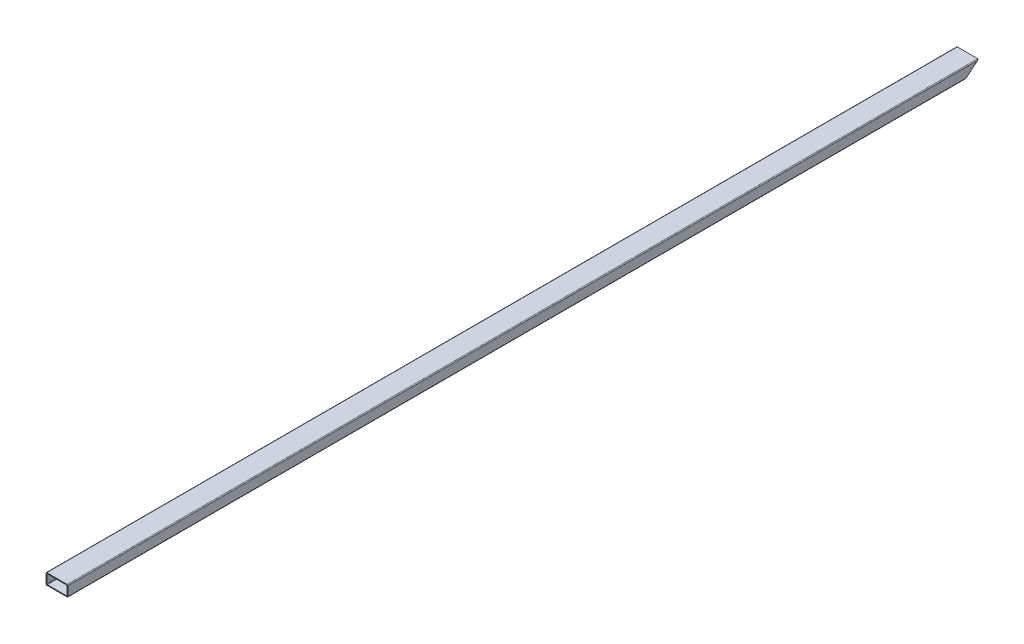
ISO-10303-21;
HEADER;
FILE_DESCRIPTION(('STEP AP214'),'2;1');
FILE_NAME('part.step','',(''),(''),'','','');
FILE_SCHEMA(('AUTOMOTIVE_DESIGN { 1 0 10303 214 1 1 1 1 }'));
ENDSEC;
DATA;
#1=APPLICATION_CONTEXT('core data for automotive mechanical design processes');
#2=APPLICATION_PROTOCOL_DEFINITION('international standard','automotive_design',2000,#1);
#3=PRODUCT_CONTEXT('',#1,'mechanical');
#4=PRODUCT('Part','Part','',(#3));
#5=PRODUCT_RELATED_PRODUCT_CATEGORY('part','',(#4));
#6=PRODUCT_DEFINITION_FORMATION('','',#4);
#7=PRODUCT_DEFINITION_CONTEXT('part definition',#1,'design');
#8=PRODUCT_DEFINITION('design','',#6,#7);
#9=PRODUCT_DEFINITION_SHAPE('','',#8);
#10=(LENGTH_UNIT() NAMED_UNIT(*) SI_UNIT(.MILLI.,.METRE.));
#11=(NAMED_UNIT(*) PLANE_ANGLE_UNIT() SI_UNIT($,.RADIAN.));
#12=(NAMED_UNIT(*) SI_UNIT($,.STERADIAN.) SOLID_ANGLE_UNIT());
#13=UNCERTAINTY_MEASURE_WITH_UNIT(LENGTH_MEASURE(1.E-05),#10,'distance_accuracy_value','');
#14=(GEOMETRIC_REPRESENTATION_CONTEXT(3) GLOBAL_UNCERTAINTY_ASSIGNED_CONTEXT((#13)) GLOBAL_UNIT_ASSIGNED_CONTEXT((#10,
#11,#12)) REPRESENTATION_CONTEXT('',''));
#15=CARTESIAN_POINT('',(0.,0.,0.));
#16=DIRECTION('',(0.,0.,1.));
#17=DIRECTION('',(1.,0.,0.));
#18=AXIS2_PLACEMENT_3D('',#15,#16,#17);
#19=CARTESIAN_POINT('',(40.,18.5,-1705.54182767969));
#20=DIRECTION('',(1.,0.,0.));
#21=DIRECTION('',(0.,0.,-1.));
#22=AXIS2_PLACEMENT_3D('',#19,#20,#21);
#23=PLANE('',#22);
#24=DIRECTION('',(0.,-0.636154901199816,0.771561366113838));
#25=VECTOR('',#24,1.);
#26=CARTESIAN_POINT('',(40.,41.6678769837693,-1686.43983639174));
#27=LINE('',#26,#25);
#28=CARTESIAN_POINT('',(40.,18.5,-1658.34064422669));
#29=VERTEX_POINT('',#28);
#30=CARTESIAN_POINT('',(40.,1.50000000000003,-1637.72217033111));
#31=VERTEX_POINT('',#30);
#32=EDGE_CURVE('E11',#29,#31,#27,.T.);
#33=ORIENTED_EDGE('',*,*,#32,.F.);
#34=DIRECTION('',(0.,0.,1.));
#35=VECTOR('',#34,1.);
#36=CARTESIAN_POINT('',(40.,18.5,-1705.54182767969));
#37=LINE('',#36,#35);
#38=CARTESIAN_POINT('',(40.,18.5,0.));
#39=VERTEX_POINT('',#38);
#40=EDGE_CURVE('E234',#29,#39,#37,.T.);
#41=ORIENTED_EDGE('',*,*,#40,.T.);
#42=DIRECTION('',(0.,1.,0.));
#43=VECTOR('',#42,1.);
#44=CARTESIAN_POINT('',(40.,18.5,0.));
#45=LINE('',#44,#43);
#46=CARTESIAN_POINT('',(40.,1.50000000000003,0.));
#47=VERTEX_POINT('',#46);
#48=EDGE_CURVE('E200',#47,#39,#45,.T.);
#49=ORIENTED_EDGE('',*,*,#48,.F.);
#50=DIRECTION('',(0.,0.,1.));
#51=VECTOR('',#50,1.);
#52=CARTESIAN_POINT('',(40.,1.50000000000003,-1705.54182767969));
#53=LINE('',#52,#51);
#54=EDGE_CURVE('E221',#31,#47,#53,.T.);
#55=ORIENTED_EDGE('',*,*,#54,.F.);
#56=EDGE_LOOP('',(#33,#41,#49,#55));
#57=FACE_BOUND('',#56,.T.);
#58=ADVANCED_FACE('F35',(#57),#23,.T.);
#59=CARTESIAN_POINT('',(38.5,18.5,-1705.54182767969));
#60=DIRECTION('',(0.,0.,1.));
#61=DIRECTION('',(1.,0.,0.));
#62=AXIS2_PLACEMENT_3D('',#59,#60,#61);
#63=CYLINDRICAL_SURFACE('',#62,1.50000000000001);
#64=CARTESIAN_POINT('',(38.5,18.5,-1658.34064422669));
#65=DIRECTION('',(0.,0.771561366113838,0.636154901199816));
#66=DIRECTION('',(0.,-0.636154901199816,0.771561366113838));
#67=AXIS2_PLACEMENT_3D('',#64,#65,#66);
#68=ELLIPSE('',#67,2.35791628292251,1.50000000000001);
#69=CARTESIAN_POINT('',(38.5,20.,-1660.15992133512));
#70=VERTEX_POINT('',#69);
#71=EDGE_CURVE('E301',#70,#29,#68,.F.);
#72=ORIENTED_EDGE('',*,*,#71,.F.);
#73=DIRECTION('',(0.,0.,1.));
#74=VECTOR('',#73,1.);
#75=CARTESIAN_POINT('',(38.5,20.,-1705.54182767969));
#76=LINE('',#75,#74);
#77=CARTESIAN_POINT('',(38.5,20.,0.));
#78=VERTEX_POINT('',#77);
#79=EDGE_CURVE('E232',#70,#78,#76,.T.);
#80=ORIENTED_EDGE('',*,*,#79,.T.);
#81=CARTESIAN_POINT('',(38.5,18.5,0.));
#82=DIRECTION('',(0.,0.,1.));
#83=DIRECTION('',(-1.,0.,0.));
#84=AXIS2_PLACEMENT_3D('',#81,#82,#83);
#85=CIRCLE('',#84,1.50000000000001);
#86=EDGE_CURVE('E203',#39,#78,#85,.T.);
#87=ORIENTED_EDGE('',*,*,#86,.F.);
#88=ORIENTED_EDGE('',*,*,#40,.F.);
#89=EDGE_LOOP('',(#72,#80,#87,#88));
#90=FACE_BOUND('',#89,.T.);
#91=ADVANCED_FACE('F325',(#90),#63,.T.);
#92=CARTESIAN_POINT('',(38.5,20.,-1705.54182767969));
#93=DIRECTION('',(0.,1.,0.));
#94=DIRECTION('',(-1.,0.,0.));
#95=AXIS2_PLACEMENT_3D('',#92,#93,#94);
#96=PLANE('',#95);
#97=DIRECTION('',(1.,0.,0.));
#98=VECTOR('',#97,1.);
#99=CARTESIAN_POINT('',(38.5,20.,-1660.15992133512));
#100=LINE('',#99,#98);
#101=CARTESIAN_POINT('',(1.50000000000002,20.,-1660.15992133512));
#102=VERTEX_POINT('',#101);
#103=EDGE_CURVE('E303',#102,#70,#100,.T.);
#104=ORIENTED_EDGE('',*,*,#103,.F.);
#105=DIRECTION('',(0.,0.,1.));
#106=VECTOR('',#105,1.);
#107=CARTESIAN_POINT('',(1.50000000000002,20.,-1705.54182767969));
#108=LINE('',#107,#106);
#109=CARTESIAN_POINT('',(1.50000000000002,20.,0.));
#110=VERTEX_POINT('',#109);
#111=EDGE_CURVE('E230',#102,#110,#108,.T.);
#112=ORIENTED_EDGE('',*,*,#111,.T.);
#113=DIRECTION('',(-1.,0.,0.));
#114=VECTOR('',#113,1.);
#115=CARTESIAN_POINT('',(38.5,20.,0.));
#116=LINE('',#115,#114);
#117=EDGE_CURVE('E206',#78,#110,#116,.T.);
#118=ORIENTED_EDGE('',*,*,#117,.F.);
#119=ORIENTED_EDGE('',*,*,#79,.F.);
#120=EDGE_LOOP('',(#104,#112,#118,#119));
#121=FACE_BOUND('',#120,.T.);
#122=ADVANCED_FACE('F322',(#121),#96,.T.);
#123=CARTESIAN_POINT('',(1.50000000000002,18.5,-1705.54182767969));
#124=DIRECTION('',(0.,0.,1.));
#125=DIRECTION('',(1.,0.,0.));
#126=AXIS2_PLACEMENT_3D('',#123,#124,#125);
#127=CYLINDRICAL_SURFACE('',#126,1.5);
#128=CARTESIAN_POINT('',(1.50000000000002,18.5,-1658.34064422669));
#129=DIRECTION('',(0.,0.771561366113838,0.636154901199816));
#130=DIRECTION('',(0.,-0.636154901199816,0.771561366113838));
#131=AXIS2_PLACEMENT_3D('',#128,#129,#130);
#132=ELLIPSE('',#131,2.3579162829225,1.5);
#133=CARTESIAN_POINT('',(0.,18.5,-1658.34064422669));
#134=VERTEX_POINT('',#133);
#135=EDGE_CURVE('E305',#134,#102,#132,.F.);
#136=ORIENTED_EDGE('',*,*,#135,.F.);
#137=DIRECTION('',(0.,0.,1.));
#138=VECTOR('',#137,1.);
#139=CARTESIAN_POINT('',(0.,18.5,-1705.54182767969));
#140=LINE('',#139,#138);
#141=CARTESIAN_POINT('',(0.,18.5,0.));
#142=VERTEX_POINT('',#141);
#143=EDGE_CURVE('E228',#134,#142,#140,.T.);
#144=ORIENTED_EDGE('',*,*,#143,.T.);
#145=CARTESIAN_POINT('',(1.50000000000002,18.5,0.));
#146=DIRECTION('',(0.,0.,1.));
#147=DIRECTION('',(1.,0.,0.));
#148=AXIS2_PLACEMENT_3D('',#145,#146,#147);
#149=CIRCLE('',#148,1.5);
#150=EDGE_CURVE('E209',#110,#142,#149,.T.);
#151=ORIENTED_EDGE('',*,*,#150,.F.);
#152=ORIENTED_EDGE('',*,*,#111,.F.);
#153=EDGE_LOOP('',(#136,#144,#151,#152));
#154=FACE_BOUND('',#153,.T.);
#155=ADVANCED_FACE('F315',(#154),#127,.T.);
#156=CARTESIAN_POINT('',(0.,18.5,-1705.54182767969));
#157=DIRECTION('',(-1.,0.,0.));
#158=DIRECTION('',(0.,0.,1.));
#159=AXIS2_PLACEMENT_3D('',#156,#157,#158);
#160=PLANE('',#159);
#161=DIRECTION('',(0.,0.636154901199816,-0.771561366113838));
#162=VECTOR('',#161,1.);
#163=CARTESIAN_POINT('',(0.,41.6678769837693,-1686.43983639174));
#164=LINE('',#163,#162);
#165=CARTESIAN_POINT('',(0.,1.50000000000003,-1637.72217033111));
#166=VERTEX_POINT('',#165);
#167=EDGE_CURVE('E259',#166,#134,#164,.T.);
#168=ORIENTED_EDGE('',*,*,#167,.F.);
#169=DIRECTION('',(0.,0.,1.));
#170=VECTOR('',#169,1.);
#171=CARTESIAN_POINT('',(0.,1.50000000000003,-1705.54182767969));
#172=LINE('',#171,#170);
#173=CARTESIAN_POINT('',(0.,1.50000000000003,0.));
#174=VERTEX_POINT('',#173);
#175=EDGE_CURVE('E226',#166,#174,#172,.T.);
#176=ORIENTED_EDGE('',*,*,#175,.T.);
#177=DIRECTION('',(0.,-1.,0.));
#178=VECTOR('',#177,1.);
#179=CARTESIAN_POINT('',(0.,18.5,0.));
#180=LINE('',#179,#178);
#181=EDGE_CURVE('E212',#142,#174,#180,.T.);
#182=ORIENTED_EDGE('',*,*,#181,.F.);
#183=ORIENTED_EDGE('',*,*,#143,.F.);
#184=EDGE_LOOP('',(#168,#176,#182,#183));
#185=FACE_BOUND('',#184,.T.);
#186=ADVANCED_FACE('F318',(#185),#160,.T.);
#187=CARTESIAN_POINT('',(1.50000000000002,1.50000000000001,-1705.54182767969));
#188=DIRECTION('',(0.,0.,1.));
#189=DIRECTION('',(1.,0.,0.));
#190=AXIS2_PLACEMENT_3D('',#187,#188,#189);
#191=CYLINDRICAL_SURFACE('',#190,1.5);
#192=CARTESIAN_POINT('',(1.50000000000002,1.50000000000001,-1637.72217033111));
#193=DIRECTION('',(0.,0.771561366113838,0.636154901199816));
#194=DIRECTION('',(0.,-0.636154901199816,0.771561366113838));
#195=AXIS2_PLACEMENT_3D('',#192,#193,#194);
#196=ELLIPSE('',#195,2.3579162829225,1.5);
#197=CARTESIAN_POINT('',(1.50000000000002,0.,-1635.90289322267));
#198=VERTEX_POINT('',#197);
#199=EDGE_CURVE('E255',#198,#166,#196,.F.);
#200=ORIENTED_EDGE('',*,*,#199,.F.);
#201=DIRECTION('',(0.,0.,1.));
#202=VECTOR('',#201,1.);
#203=CARTESIAN_POINT('',(1.50000000000002,0.,-1705.54182767969));
#204=LINE('',#203,#202);
#205=CARTESIAN_POINT('',(1.50000000000002,0.,0.));
#206=VERTEX_POINT('',#205);
#207=EDGE_CURVE('E224',#198,#206,#204,.T.);
#208=ORIENTED_EDGE('',*,*,#207,.T.);
#209=CARTESIAN_POINT('',(1.50000000000002,1.50000000000001,0.));
#210=DIRECTION('',(0.,0.,1.));
#211=DIRECTION('',(-1.,0.,0.));
#212=AXIS2_PLACEMENT_3D('',#209,#210,#211);
#213=CIRCLE('',#212,1.5);
#214=EDGE_CURVE('E215',#174,#206,#213,.T.);
#215=ORIENTED_EDGE('',*,*,#214,.F.);
#216=ORIENTED_EDGE('',*,*,#175,.F.);
#217=EDGE_LOOP('',(#200,#208,#215,#216));
#218=FACE_BOUND('',#217,.T.);
#219=ADVANCED_FACE('F338',(#218),#191,.T.);
#220=CARTESIAN_POINT('',(38.5,0.,-1705.54182767969));
#221=DIRECTION('',(0.,-1.,0.));
#222=DIRECTION('',(1.,0.,0.));
#223=AXIS2_PLACEMENT_3D('',#220,#221,#222);
#224=PLANE('',#223);
#225=DIRECTION('',(-1.,0.,0.));
#226=VECTOR('',#225,1.);
#227=CARTESIAN_POINT('',(38.5,0.,-1635.90289322267));
#228=LINE('',#227,#226);
#229=CARTESIAN_POINT('',(38.5,0.,-1635.90289322267));
#230=VERTEX_POINT('',#229);
#231=EDGE_CURVE('E252',#230,#198,#228,.T.);
#232=ORIENTED_EDGE('',*,*,#231,.F.);
#233=DIRECTION('',(0.,0.,1.));
#234=VECTOR('',#233,1.);
#235=CARTESIAN_POINT('',(38.5,0.,-1705.54182767969));
#236=LINE('',#235,#234);
#237=CARTESIAN_POINT('',(38.5,0.,0.));
#238=VERTEX_POINT('',#237);
#239=EDGE_CURVE('E222',#230,#238,#236,.T.);
#240=ORIENTED_EDGE('',*,*,#239,.T.);
#241=DIRECTION('',(1.,0.,0.));
#242=VECTOR('',#241,1.);
#243=CARTESIAN_POINT('',(38.5,0.,0.));
#244=LINE('',#243,#242);
#245=EDGE_CURVE('E218',#206,#238,#244,.T.);
#246=ORIENTED_EDGE('',*,*,#245,.F.);
#247=ORIENTED_EDGE('',*,*,#207,.F.);
#248=EDGE_LOOP('',(#232,#240,#246,#247));
#249=FACE_BOUND('',#248,.T.);
#250=ADVANCED_FACE('F251',(#249),#224,.T.);
#251=CARTESIAN_POINT('',(38.5,1.50000000000001,-1705.54182767969));
#252=DIRECTION('',(0.,0.,1.));
#253=DIRECTION('',(1.,0.,0.));
#254=AXIS2_PLACEMENT_3D('',#251,#252,#253);
#255=CYLINDRICAL_SURFACE('',#254,1.5);
#256=CARTESIAN_POINT('',(38.5,1.50000000000001,-1637.72217033111));
#257=DIRECTION('',(0.,0.771561366113838,0.636154901199816));
#258=DIRECTION('',(0.,-0.636154901199816,0.771561366113838));
#259=AXIS2_PLACEMENT_3D('',#256,#257,#258);
#260=ELLIPSE('',#259,2.3579162829225,1.5);
#261=EDGE_CURVE('E241',#31,#230,#260,.F.);
#262=ORIENTED_EDGE('',*,*,#261,.F.);
#263=ORIENTED_EDGE('',*,*,#54,.T.);
#264=CARTESIAN_POINT('',(38.5,1.50000000000001,0.));
#265=DIRECTION('',(0.,0.,1.));
#266=DIRECTION('',(-1.,0.,0.));
#267=AXIS2_PLACEMENT_3D('',#264,#265,#266);
#268=CIRCLE('',#267,1.5);
#269=EDGE_CURVE('E187',#238,#47,#268,.T.);
#270=ORIENTED_EDGE('',*,*,#269,.F.);
#271=ORIENTED_EDGE('',*,*,#239,.F.);
#272=EDGE_LOOP('',(#262,#263,#270,#271));
#273=FACE_BOUND('',#272,.T.);
#274=ADVANCED_FACE('F37',(#273),#255,.T.);
#275=CARTESIAN_POINT('',(38.5,1.50000000000001,0.));
#276=DIRECTION('',(0.,0.,-1.));
#277=DIRECTION('',(-1.,0.,0.));
#278=AXIS2_PLACEMENT_3D('',#275,#276,#277);
#279=PLANE('',#278);
#280=DIRECTION('',(1.,0.,0.));
#281=VECTOR('',#280,1.);
#282=CARTESIAN_POINT('',(37.5,1.50000000000001,0.));
#283=LINE('',#282,#281);
#284=CARTESIAN_POINT('',(2.50000000000002,1.50000000000001,0.));
#285=VERTEX_POINT('',#284);
#286=CARTESIAN_POINT('',(37.5,1.50000000000001,0.));
#287=VERTEX_POINT('',#286);
#288=EDGE_CURVE('E156',#285,#287,#283,.T.);
#289=ORIENTED_EDGE('',*,*,#288,.F.);
#290=CARTESIAN_POINT('',(2.50000000000002,2.50000000000001,0.));
#291=DIRECTION('',(0.,0.,1.));
#292=DIRECTION('',(-1.,0.,0.));
#293=AXIS2_PLACEMENT_3D('',#290,#291,#292);
#294=CIRCLE('',#293,0.999999999999994);
#295=CARTESIAN_POINT('',(1.50000000000003,2.50000000000001,0.));
#296=VERTEX_POINT('',#295);
#297=EDGE_CURVE('E162',#296,#285,#294,.T.);
#298=ORIENTED_EDGE('',*,*,#297,.F.);
#299=DIRECTION('',(0.,-1.,0.));
#300=VECTOR('',#299,1.);
#301=CARTESIAN_POINT('',(1.50000000000002,17.5,0.));
#302=LINE('',#301,#300);
#303=CARTESIAN_POINT('',(1.50000000000002,17.5,0.));
#304=VERTEX_POINT('',#303);
#305=EDGE_CURVE('E182',#304,#296,#302,.T.);
#306=ORIENTED_EDGE('',*,*,#305,.F.);
#307=CARTESIAN_POINT('',(2.50000000000002,17.5,0.));
#308=DIRECTION('',(0.,0.,1.));
#309=DIRECTION('',(1.,0.,0.));
#310=AXIS2_PLACEMENT_3D('',#307,#308,#309);
#311=CIRCLE('',#310,0.999999999999997);
#312=CARTESIAN_POINT('',(2.50000000000002,18.5,0.));
#313=VERTEX_POINT('',#312);
#314=EDGE_CURVE('E179',#313,#304,#311,.T.);
#315=ORIENTED_EDGE('',*,*,#314,.F.);
#316=DIRECTION('',(-1.,0.,0.));
#317=VECTOR('',#316,1.);
#318=CARTESIAN_POINT('',(37.5,18.5,0.));
#319=LINE('',#318,#317);
#320=CARTESIAN_POINT('',(37.5,18.5,0.));
#321=VERTEX_POINT('',#320);
#322=EDGE_CURVE('E176',#321,#313,#319,.T.);
#323=ORIENTED_EDGE('',*,*,#322,.F.);
#324=CARTESIAN_POINT('',(37.5,17.5,0.));
#325=DIRECTION('',(0.,0.,1.));
#326=DIRECTION('',(-1.,0.,0.));
#327=AXIS2_PLACEMENT_3D('',#324,#325,#326);
#328=CIRCLE('',#327,1.);
#329=CARTESIAN_POINT('',(38.5,17.5,0.));
#330=VERTEX_POINT('',#329);
#331=EDGE_CURVE('E170',#330,#321,#328,.T.);
#332=ORIENTED_EDGE('',*,*,#331,.F.);
#333=DIRECTION('',(0.,1.,0.));
#334=VECTOR('',#333,1.);
#335=CARTESIAN_POINT('',(38.5,17.5,0.));
#336=LINE('',#335,#334);
#337=CARTESIAN_POINT('',(38.5,2.50000000000001,0.));
#338=VERTEX_POINT('',#337);
#339=EDGE_CURVE('E168',#338,#330,#336,.T.);
#340=ORIENTED_EDGE('',*,*,#339,.F.);
#341=CARTESIAN_POINT('',(37.5,2.50000000000001,0.));
#342=DIRECTION('',(0.,0.,1.));
#343=DIRECTION('',(-1.,0.,0.));
#344=AXIS2_PLACEMENT_3D('',#341,#342,#343);
#345=CIRCLE('',#344,1.);
#346=EDGE_CURVE('E149',#287,#338,#345,.T.);
#347=ORIENTED_EDGE('',*,*,#346,.F.);
#348=EDGE_LOOP('',(#289,#298,#306,#315,#323,#332,#340,#347));
#349=FACE_BOUND('',#348,.T.);
#350=ORIENTED_EDGE('',*,*,#269,.T.);
#351=ORIENTED_EDGE('',*,*,#48,.T.);
#352=ORIENTED_EDGE('',*,*,#86,.T.);
#353=ORIENTED_EDGE('',*,*,#117,.T.);
#354=ORIENTED_EDGE('',*,*,#150,.T.);
#355=ORIENTED_EDGE('',*,*,#181,.T.);
#356=ORIENTED_EDGE('',*,*,#214,.T.);
#357=ORIENTED_EDGE('',*,*,#245,.T.);
#358=EDGE_LOOP('',(#350,#351,#352,#353,#354,#355,#356,#357));
#359=FACE_BOUND('',#358,.T.);
#360=ADVANCED_FACE('F164',(#349,#359),#279,.F.);
#361=CARTESIAN_POINT('',(37.5,1.50000000000001,-1705.54182767969));
#362=DIRECTION('',(0.,-1.,0.));
#363=DIRECTION('',(1.,0.,0.));
#364=AXIS2_PLACEMENT_3D('',#361,#362,#363);
#365=PLANE('',#364);
#366=DIRECTION('',(0.,0.,1.));
#367=VECTOR('',#366,1.);
#368=CARTESIAN_POINT('',(37.5,1.50000000000001,-1705.54182767969));
#369=LINE('',#368,#367);
#370=CARTESIAN_POINT('',(37.5,1.50000000000001,-1637.72217033111));
#371=VERTEX_POINT('',#370);
#372=EDGE_CURVE('E145',#371,#287,#369,.T.);
#373=ORIENTED_EDGE('',*,*,#372,.F.);
#374=DIRECTION('',(-1.,0.,0.));
#375=VECTOR('',#374,1.);
#376=CARTESIAN_POINT('',(37.5,1.50000000000001,-1637.72217033111));
#377=LINE('',#376,#375);
#378=CARTESIAN_POINT('',(2.50000000000002,1.50000000000001,-1637.72217033111));
#379=VERTEX_POINT('',#378);
#380=EDGE_CURVE('E39',#371,#379,#377,.T.);
#381=ORIENTED_EDGE('',*,*,#380,.T.);
#382=DIRECTION('',(0.,0.,1.));
#383=VECTOR('',#382,1.);
#384=CARTESIAN_POINT('',(2.50000000000002,1.50000000000001,-1705.54182767969));
#385=LINE('',#384,#383);
#386=EDGE_CURVE('E153',#379,#285,#385,.T.);
#387=ORIENTED_EDGE('',*,*,#386,.T.);
#388=ORIENTED_EDGE('',*,*,#288,.T.);
#389=EDGE_LOOP('',(#373,#381,#387,#388));
#390=FACE_BOUND('',#389,.T.);
#391=ADVANCED_FACE('F157',(#390),#365,.F.);
#392=CARTESIAN_POINT('',(37.5,2.50000000000001,-1705.54182767969));
#393=DIRECTION('',(0.,0.,1.));
#394=DIRECTION('',(1.,0.,0.));
#395=AXIS2_PLACEMENT_3D('',#392,#393,#394);
#396=CYLINDRICAL_SURFACE('',#395,1.);
#397=DIRECTION('',(0.,0.,1.));
#398=VECTOR('',#397,1.);
#399=CARTESIAN_POINT('',(38.5,2.50000000000001,-1705.54182767969));
#400=LINE('',#399,#398);
#401=CARTESIAN_POINT('',(38.5,2.50000000000001,-1638.93502173673));
#402=VERTEX_POINT('',#401);
#403=EDGE_CURVE('E152',#402,#338,#400,.T.);
#404=ORIENTED_EDGE('',*,*,#403,.F.);
#405=CARTESIAN_POINT('',(37.5,2.50000000000001,-1638.93502173673));
#406=DIRECTION('',(0.,0.771561366113838,0.636154901199816));
#407=DIRECTION('',(0.,-0.636154901199816,0.771561366113838));
#408=AXIS2_PLACEMENT_3D('',#405,#406,#407);
#409=ELLIPSE('',#408,1.57194418861501,1.);
#410=EDGE_CURVE('E44',#402,#371,#409,.F.);
#411=ORIENTED_EDGE('',*,*,#410,.T.);
#412=ORIENTED_EDGE('',*,*,#372,.T.);
#413=ORIENTED_EDGE('',*,*,#346,.T.);
#414=EDGE_LOOP('',(#404,#411,#412,#413));
#415=FACE_BOUND('',#414,.T.);
#416=ADVANCED_FACE('F147',(#415),#396,.F.);
#417=CARTESIAN_POINT('',(38.5,17.5,-1705.54182767969));
#418=DIRECTION('',(1.,0.,0.));
#419=DIRECTION('',(0.,1.,0.));
#420=AXIS2_PLACEMENT_3D('',#417,#418,#419);
#421=PLANE('',#420);
#422=DIRECTION('',(0.,0.,1.));
#423=VECTOR('',#422,1.);
#424=CARTESIAN_POINT('',(38.5,17.5,-1705.54182767969));
#425=LINE('',#424,#423);
#426=CARTESIAN_POINT('',(38.5,17.5,-1657.12779282107));
#427=VERTEX_POINT('',#426);
#428=EDGE_CURVE('E194',#427,#330,#425,.T.);
#429=ORIENTED_EDGE('',*,*,#428,.F.);
#430=DIRECTION('',(0.,-0.636154901199816,0.771561366113838));
#431=VECTOR('',#430,1.);
#432=CARTESIAN_POINT('',(38.5,41.2631839254487,-1685.94900384711));
#433=LINE('',#432,#431);
#434=EDGE_CURVE('E291',#427,#402,#433,.T.);
#435=ORIENTED_EDGE('',*,*,#434,.T.);
#436=ORIENTED_EDGE('',*,*,#403,.T.);
#437=ORIENTED_EDGE('',*,*,#339,.T.);
#438=EDGE_LOOP('',(#429,#435,#436,#437));
#439=FACE_BOUND('',#438,.T.);
#440=ADVANCED_FACE('F290',(#439),#421,.F.);
#441=CARTESIAN_POINT('',(37.5,17.5,-1705.54182767969));
#442=DIRECTION('',(0.,0.,1.));
#443=DIRECTION('',(1.,0.,0.));
#444=AXIS2_PLACEMENT_3D('',#441,#442,#443);
#445=CYLINDRICAL_SURFACE('',#444,1.);
#446=DIRECTION('',(0.,0.,1.));
#447=VECTOR('',#446,1.);
#448=CARTESIAN_POINT('',(37.5,18.5,-1705.54182767969));
#449=LINE('',#448,#447);
#450=CARTESIAN_POINT('',(37.5,18.5,-1658.34064422669));
#451=VERTEX_POINT('',#450);
#452=EDGE_CURVE('E192',#451,#321,#449,.T.);
#453=ORIENTED_EDGE('',*,*,#452,.F.);
#454=CARTESIAN_POINT('',(37.5,17.5,-1657.12779282107));
#455=DIRECTION('',(0.,0.771561366113838,0.636154901199816));
#456=DIRECTION('',(0.,-0.636154901199816,0.771561366113838));
#457=AXIS2_PLACEMENT_3D('',#454,#455,#456);
#458=ELLIPSE('',#457,1.571944188615,1.);
#459=EDGE_CURVE('E287',#451,#427,#458,.F.);
#460=ORIENTED_EDGE('',*,*,#459,.T.);
#461=ORIENTED_EDGE('',*,*,#428,.T.);
#462=ORIENTED_EDGE('',*,*,#331,.T.);
#463=EDGE_LOOP('',(#453,#460,#461,#462));
#464=FACE_BOUND('',#463,.T.);
#465=ADVANCED_FACE('F284',(#464),#445,.F.);
#466=CARTESIAN_POINT('',(37.5,18.5,-1705.54182767969));
#467=DIRECTION('',(0.,1.,0.));
#468=DIRECTION('',(-1.,0.,0.));
#469=AXIS2_PLACEMENT_3D('',#466,#467,#468);
#470=PLANE('',#469);
#471=DIRECTION('',(0.,0.,1.));
#472=VECTOR('',#471,1.);
#473=CARTESIAN_POINT('',(2.50000000000002,18.5,-1705.54182767969));
#474=LINE('',#473,#472);
#475=CARTESIAN_POINT('',(2.50000000000002,18.5,-1658.34064422669));
#476=VERTEX_POINT('',#475);
#477=EDGE_CURVE('E190',#476,#313,#474,.T.);
#478=ORIENTED_EDGE('',*,*,#477,.F.);
#479=DIRECTION('',(1.,0.,0.));
#480=VECTOR('',#479,1.);
#481=CARTESIAN_POINT('',(37.5,18.5,-1658.34064422669));
#482=LINE('',#481,#480);
#483=EDGE_CURVE('E294',#476,#451,#482,.T.);
#484=ORIENTED_EDGE('',*,*,#483,.T.);
#485=ORIENTED_EDGE('',*,*,#452,.T.);
#486=ORIENTED_EDGE('',*,*,#322,.T.);
#487=EDGE_LOOP('',(#478,#484,#485,#486));
#488=FACE_BOUND('',#487,.T.);
#489=ADVANCED_FACE('F281',(#488),#470,.F.);
#490=CARTESIAN_POINT('',(2.50000000000002,17.5,-1705.54182767969));
#491=DIRECTION('',(0.,0.,1.));
#492=DIRECTION('',(1.,0.,0.));
#493=AXIS2_PLACEMENT_3D('',#490,#491,#492);
#494=CYLINDRICAL_SURFACE('',#493,0.999999999999997);
#495=DIRECTION('',(0.,0.,1.));
#496=VECTOR('',#495,1.);
#497=CARTESIAN_POINT('',(1.50000000000002,17.5,-1705.54182767969));
#498=LINE('',#497,#496);
#499=CARTESIAN_POINT('',(1.50000000000002,17.5,-1657.12779282107));
#500=VERTEX_POINT('',#499);
#501=EDGE_CURVE('E188',#500,#304,#498,.T.);
#502=ORIENTED_EDGE('',*,*,#501,.F.);
#503=CARTESIAN_POINT('',(2.50000000000002,17.5,-1657.12779282107));
#504=DIRECTION('',(0.,0.771561366113838,0.636154901199816));
#505=DIRECTION('',(0.,-0.636154901199816,0.771561366113838));
#506=AXIS2_PLACEMENT_3D('',#503,#504,#505);
#507=ELLIPSE('',#506,1.57194418861499,0.999999999999997);
#508=EDGE_CURVE('E278',#500,#476,#507,.F.);
#509=ORIENTED_EDGE('',*,*,#508,.T.);
#510=ORIENTED_EDGE('',*,*,#477,.T.);
#511=ORIENTED_EDGE('',*,*,#314,.T.);
#512=EDGE_LOOP('',(#502,#509,#510,#511));
#513=FACE_BOUND('',#512,.T.);
#514=ADVANCED_FACE('F276',(#513),#494,.F.);
#515=CARTESIAN_POINT('',(1.50000000000002,17.5,-1705.54182767969));
#516=DIRECTION('',(-1.,0.,0.));
#517=DIRECTION('',(0.,-1.,0.));
#518=AXIS2_PLACEMENT_3D('',#515,#516,#517);
#519=PLANE('',#518);
#520=DIRECTION('',(0.,0.,1.));
#521=VECTOR('',#520,1.);
#522=CARTESIAN_POINT('',(1.50000000000003,2.50000000000001,-1705.54182767969));
#523=LINE('',#522,#521);
#524=CARTESIAN_POINT('',(1.50000000000003,2.50000000000001,-1638.93502173673));
#525=VERTEX_POINT('',#524);
#526=EDGE_CURVE('E185',#525,#296,#523,.T.);
#527=ORIENTED_EDGE('',*,*,#526,.F.);
#528=DIRECTION('',(0.,0.636154901199816,-0.771561366113838));
#529=VECTOR('',#528,1.);
#530=CARTESIAN_POINT('',(1.49999999999999,41.2631839254487,-1685.94900384711));
#531=LINE('',#530,#529);
#532=EDGE_CURVE('E273',#525,#500,#531,.T.);
#533=ORIENTED_EDGE('',*,*,#532,.T.);
#534=ORIENTED_EDGE('',*,*,#501,.T.);
#535=ORIENTED_EDGE('',*,*,#305,.T.);
#536=EDGE_LOOP('',(#527,#533,#534,#535));
#537=FACE_BOUND('',#536,.T.);
#538=ADVANCED_FACE('F270',(#537),#519,.F.);
#539=CARTESIAN_POINT('',(2.50000000000002,2.50000000000001,-1705.54182767969));
#540=DIRECTION('',(0.,0.,1.));
#541=DIRECTION('',(1.,0.,0.));
#542=AXIS2_PLACEMENT_3D('',#539,#540,#541);
#543=CYLINDRICAL_SURFACE('',#542,0.999999999999994);
#544=ORIENTED_EDGE('',*,*,#386,.F.);
#545=CARTESIAN_POINT('',(2.50000000000002,2.50000000000001,-1638.93502173673));
#546=DIRECTION('',(0.,0.771561366113838,0.636154901199816));
#547=DIRECTION('',(0.,-0.636154901199816,0.771561366113838));
#548=AXIS2_PLACEMENT_3D('',#545,#546,#547);
#549=ELLIPSE('',#548,1.57194418861499,0.999999999999994);
#550=EDGE_CURVE('E257',#379,#525,#549,.F.);
#551=ORIENTED_EDGE('',*,*,#550,.T.);
#552=ORIENTED_EDGE('',*,*,#526,.T.);
#553=ORIENTED_EDGE('',*,*,#297,.T.);
#554=EDGE_LOOP('',(#544,#551,#552,#553));
#555=FACE_BOUND('',#554,.T.);
#556=ADVANCED_FACE('F263',(#555),#543,.F.);
#557=CARTESIAN_POINT('',(38.5000000000241,11.7688656675004,-1650.17677849008));
#558=DIRECTION('',(0.,0.771561366113838,0.636154901199816));
#559=DIRECTION('',(-1.,0.,0.));
#560=AXIS2_PLACEMENT_3D('',#557,#558,#559);
#561=PLANE('',#560);
#562=ORIENTED_EDGE('',*,*,#261,.T.);
#563=ORIENTED_EDGE('',*,*,#231,.T.);
#564=ORIENTED_EDGE('',*,*,#199,.T.);
#565=ORIENTED_EDGE('',*,*,#167,.T.);
#566=ORIENTED_EDGE('',*,*,#135,.T.);
#567=ORIENTED_EDGE('',*,*,#103,.T.);
#568=ORIENTED_EDGE('',*,*,#71,.T.);
#569=ORIENTED_EDGE('',*,*,#32,.T.);
#570=EDGE_LOOP('',(#562,#563,#564,#565,#566,#567,#568,#569));
#571=FACE_BOUND('',#570,.T.);
#572=ORIENTED_EDGE('',*,*,#380,.F.);
#573=ORIENTED_EDGE('',*,*,#410,.F.);
#574=ORIENTED_EDGE('',*,*,#434,.F.);
#575=ORIENTED_EDGE('',*,*,#459,.F.);
#576=ORIENTED_EDGE('',*,*,#483,.F.);
#577=ORIENTED_EDGE('',*,*,#508,.F.);
#578=ORIENTED_EDGE('',*,*,#532,.F.);
#579=ORIENTED_EDGE('',*,*,#550,.F.);
#580=EDGE_LOOP('',(#572,#573,#574,#575,#576,#577,#578,#579));
#581=FACE_BOUND('',#580,.T.);
#582=ADVANCED_FACE('F308',(#571,#581),#561,.F.);
#583=CLOSED_SHELL('',(#58,#91,#122,#155,#186,#219,#250,#274,#360,#391,#416,#440,#465,#489,#514,
#538,#556,#582));
#584=MANIFOLD_SOLID_BREP('B2',#583);
#585=ADVANCED_BREP_SHAPE_REPRESENTATION('',(#18,#584),#14);
#586=SHAPE_DEFINITION_REPRESENTATION(#9,#585);
ENDSEC;
END-ISO-10303-21;
